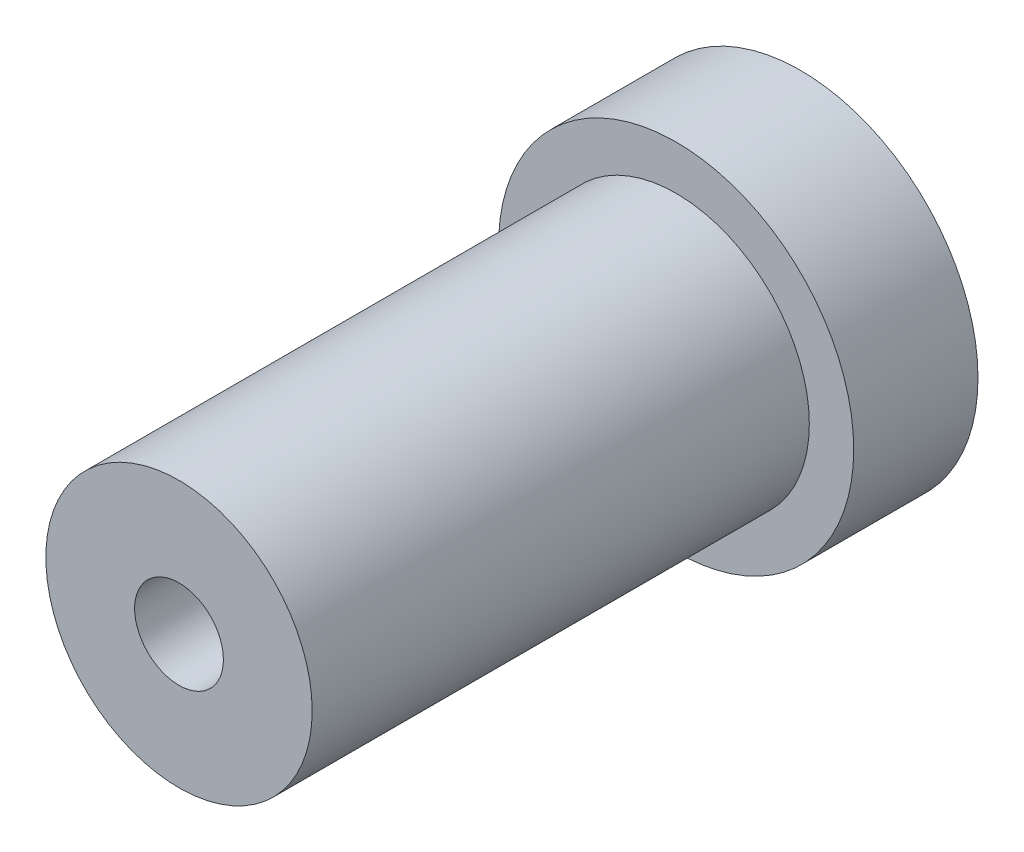
ISO-10303-21;
HEADER;
FILE_DESCRIPTION(('STEP AP214'),'2;1');
FILE_NAME('part.step','',(''),(''),'','','');
FILE_SCHEMA(('AUTOMOTIVE_DESIGN { 1 0 10303 214 1 1 1 1 }'));
ENDSEC;
DATA;
#1=APPLICATION_CONTEXT('core data for automotive mechanical design processes');
#2=APPLICATION_PROTOCOL_DEFINITION('international standard','automotive_design',2000,#1);
#3=PRODUCT_CONTEXT('',#1,'mechanical');
#4=PRODUCT('Part','Part','',(#3));
#5=PRODUCT_RELATED_PRODUCT_CATEGORY('part','',(#4));
#6=PRODUCT_DEFINITION_FORMATION('','',#4);
#7=PRODUCT_DEFINITION_CONTEXT('part definition',#1,'design');
#8=PRODUCT_DEFINITION('design','',#6,#7);
#9=PRODUCT_DEFINITION_SHAPE('','',#8);
#10=(LENGTH_UNIT() NAMED_UNIT(*) SI_UNIT(.MILLI.,.METRE.));
#11=(NAMED_UNIT(*) PLANE_ANGLE_UNIT() SI_UNIT($,.RADIAN.));
#12=(NAMED_UNIT(*) SI_UNIT($,.STERADIAN.) SOLID_ANGLE_UNIT());
#13=UNCERTAINTY_MEASURE_WITH_UNIT(LENGTH_MEASURE(1.E-05),#10,'distance_accuracy_value','');
#14=(GEOMETRIC_REPRESENTATION_CONTEXT(3) GLOBAL_UNCERTAINTY_ASSIGNED_CONTEXT((#13)) GLOBAL_UNIT_ASSIGNED_CONTEXT((#10,
#11,#12)) REPRESENTATION_CONTEXT('',''));
#15=CARTESIAN_POINT('',(0.,0.,0.));
#16=DIRECTION('',(0.,0.,1.));
#17=DIRECTION('',(1.,0.,0.));
#18=AXIS2_PLACEMENT_3D('',#15,#16,#17);
#19=CARTESIAN_POINT('',(-20.,9.99999999999999,2.8));
#20=DIRECTION('',(0.,0.,1.));
#21=DIRECTION('',(1.,0.,0.));
#22=AXIS2_PLACEMENT_3D('',#19,#20,#21);
#23=PLANE('',#22);
#24=CARTESIAN_POINT('',(-20.,9.99999999999999,2.8));
#25=DIRECTION('',(0.,0.,1.));
#26=DIRECTION('',(1.,0.,0.));
#27=AXIS2_PLACEMENT_3D('',#24,#25,#26);
#28=CIRCLE('',#27,4.);
#29=CARTESIAN_POINT('',(-16.,9.99999999999999,2.8));
#30=VERTEX_POINT('',#29);
#31=EDGE_CURVE('E12',#30,#30,#28,.T.);
#32=ORIENTED_EDGE('',*,*,#31,.T.);
#33=EDGE_LOOP('',(#32));
#34=FACE_BOUND('',#33,.T.);
#35=CARTESIAN_POINT('',(-20.,9.99999999999999,2.8));
#36=DIRECTION('',(0.,0.,1.));
#37=DIRECTION('',(1.,0.,0.));
#38=AXIS2_PLACEMENT_3D('',#35,#36,#37);
#39=CIRCLE('',#38,3.);
#40=CARTESIAN_POINT('',(-17.,9.99999999999999,2.8));
#41=VERTEX_POINT('',#40);
#42=EDGE_CURVE('E62',#41,#41,#39,.T.);
#43=ORIENTED_EDGE('',*,*,#42,.F.);
#44=EDGE_LOOP('',(#43));
#45=FACE_BOUND('',#44,.T.);
#46=ADVANCED_FACE('F46',(#34,#45),#23,.T.);
#47=CARTESIAN_POINT('',(-20.,9.99999999999999,0.));
#48=DIRECTION('',(0.,0.,1.));
#49=DIRECTION('',(1.,0.,0.));
#50=AXIS2_PLACEMENT_3D('',#47,#48,#49);
#51=PLANE('',#50);
#52=CARTESIAN_POINT('',(-20.,9.99999999999999,0.));
#53=DIRECTION('',(0.,0.,1.));
#54=DIRECTION('',(1.,0.,0.));
#55=AXIS2_PLACEMENT_3D('',#52,#53,#54);
#56=CIRCLE('',#55,4.);
#57=CARTESIAN_POINT('',(-16.,9.99999999999999,0.));
#58=VERTEX_POINT('',#57);
#59=EDGE_CURVE('E50',#58,#58,#56,.T.);
#60=ORIENTED_EDGE('',*,*,#59,.F.);
#61=EDGE_LOOP('',(#60));
#62=FACE_BOUND('',#61,.T.);
#63=CARTESIAN_POINT('',(-20.,9.99999999999999,0.));
#64=DIRECTION('',(0.,0.,1.));
#65=DIRECTION('',(1.,0.,0.));
#66=AXIS2_PLACEMENT_3D('',#63,#64,#65);
#67=CIRCLE('',#66,1.);
#68=CARTESIAN_POINT('',(-19.,9.99999999999999,0.));
#69=VERTEX_POINT('',#68);
#70=EDGE_CURVE('E57',#69,#69,#67,.T.);
#71=ORIENTED_EDGE('',*,*,#70,.T.);
#72=EDGE_LOOP('',(#71));
#73=FACE_BOUND('',#72,.T.);
#74=ADVANCED_FACE('F87',(#62,#73),#51,.F.);
#75=CARTESIAN_POINT('',(-20.,9.99999999999999,2.8));
#76=DIRECTION('',(0.,0.,-1.));
#77=DIRECTION('',(-1.,0.,0.));
#78=AXIS2_PLACEMENT_3D('',#75,#76,#77);
#79=CYLINDRICAL_SURFACE('',#78,4.);
#80=ORIENTED_EDGE('',*,*,#31,.F.);
#81=EDGE_LOOP('',(#80));
#82=FACE_BOUND('',#81,.T.);
#83=ORIENTED_EDGE('',*,*,#59,.T.);
#84=EDGE_LOOP('',(#83));
#85=FACE_BOUND('',#84,.T.);
#86=ADVANCED_FACE('F48',(#82,#85),#79,.T.);
#87=CARTESIAN_POINT('',(-20.,9.99999999999999,2.8));
#88=DIRECTION('',(0.,0.,-1.));
#89=DIRECTION('',(-1.,0.,0.));
#90=AXIS2_PLACEMENT_3D('',#87,#88,#89);
#91=CYLINDRICAL_SURFACE('',#90,1.);
#92=ORIENTED_EDGE('',*,*,#70,.F.);
#93=EDGE_LOOP('',(#92));
#94=FACE_BOUND('',#93,.T.);
#95=CARTESIAN_POINT('',(-20.,9.99999999999999,14.));
#96=DIRECTION('',(0.,0.,1.));
#97=DIRECTION('',(1.,0.,0.));
#98=AXIS2_PLACEMENT_3D('',#95,#96,#97);
#99=CIRCLE('',#98,1.);
#100=CARTESIAN_POINT('',(-19.,9.99999999999999,14.));
#101=VERTEX_POINT('',#100);
#102=EDGE_CURVE('E65',#101,#101,#99,.T.);
#103=ORIENTED_EDGE('',*,*,#102,.T.);
#104=EDGE_LOOP('',(#103));
#105=FACE_BOUND('',#104,.T.);
#106=ADVANCED_FACE('F71',(#94,#105),#91,.F.);
#107=CARTESIAN_POINT('',(-20.,9.99999999999999,14.));
#108=DIRECTION('',(0.,0.,1.));
#109=DIRECTION('',(1.,0.,0.));
#110=AXIS2_PLACEMENT_3D('',#107,#108,#109);
#111=PLANE('',#110);
#112=CARTESIAN_POINT('',(-20.,9.99999999999999,14.));
#113=DIRECTION('',(0.,0.,1.));
#114=DIRECTION('',(1.,0.,0.));
#115=AXIS2_PLACEMENT_3D('',#112,#113,#114);
#116=CIRCLE('',#115,3.);
#117=CARTESIAN_POINT('',(-17.,9.99999999999999,14.));
#118=VERTEX_POINT('',#117);
#119=EDGE_CURVE('E61',#118,#118,#116,.T.);
#120=ORIENTED_EDGE('',*,*,#119,.T.);
#121=EDGE_LOOP('',(#120));
#122=FACE_BOUND('',#121,.T.);
#123=ORIENTED_EDGE('',*,*,#102,.F.);
#124=EDGE_LOOP('',(#123));
#125=FACE_BOUND('',#124,.T.);
#126=ADVANCED_FACE('F73',(#122,#125),#111,.T.);
#127=CARTESIAN_POINT('',(-20.,9.99999999999999,14.));
#128=DIRECTION('',(0.,0.,-1.));
#129=DIRECTION('',(-1.,0.,0.));
#130=AXIS2_PLACEMENT_3D('',#127,#128,#129);
#131=CYLINDRICAL_SURFACE('',#130,3.);
#132=ORIENTED_EDGE('',*,*,#119,.F.);
#133=EDGE_LOOP('',(#132));
#134=FACE_BOUND('',#133,.T.);
#135=ORIENTED_EDGE('',*,*,#42,.T.);
#136=EDGE_LOOP('',(#135));
#137=FACE_BOUND('',#136,.T.);
#138=ADVANCED_FACE('F75',(#134,#137),#131,.T.);
#139=CLOSED_SHELL('',(#46,#74,#86,#106,#126,#138));
#140=MANIFOLD_SOLID_BREP('B2',#139);
#141=ADVANCED_BREP_SHAPE_REPRESENTATION('',(#18,#140),#14);
#142=SHAPE_DEFINITION_REPRESENTATION(#9,#141);
ENDSEC;
END-ISO-10303-21;
